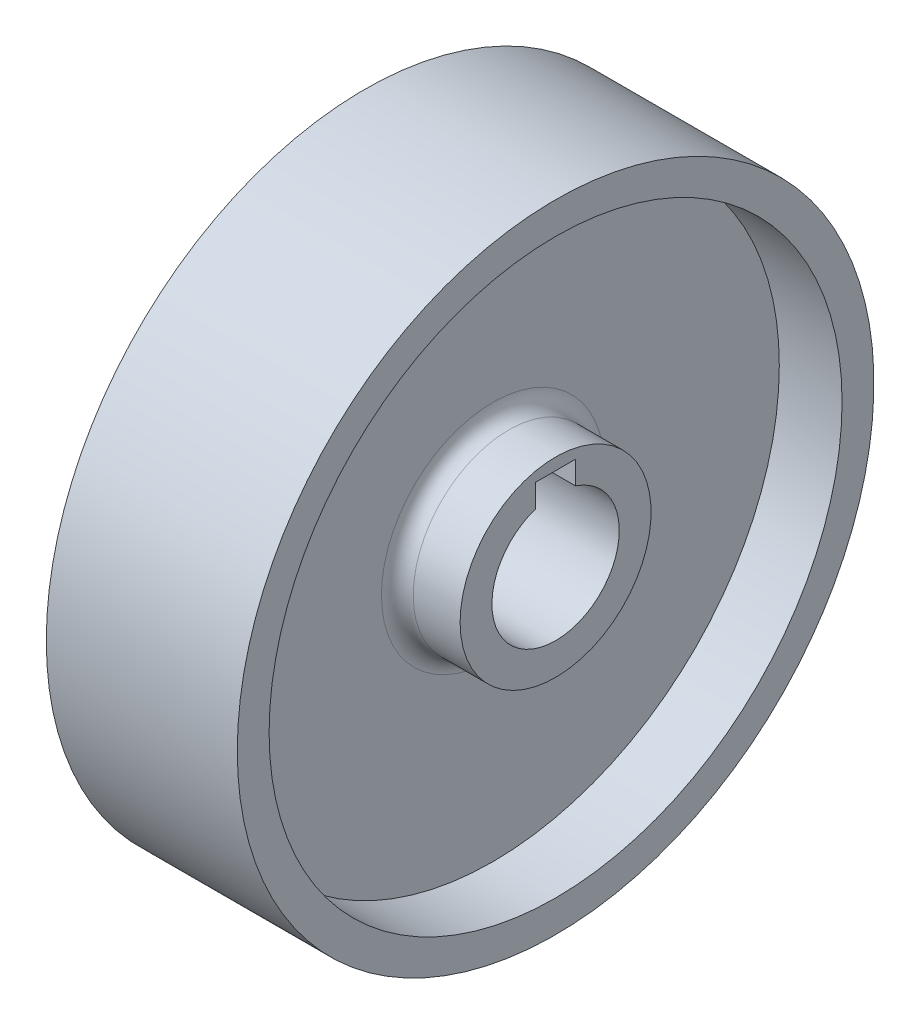
ISO-10303-21;
HEADER;
FILE_DESCRIPTION(('STEP AP214'),'2;1');
FILE_NAME('part.step','',(''),(''),'','','');
FILE_SCHEMA(('AUTOMOTIVE_DESIGN { 1 0 10303 214 1 1 1 1 }'));
ENDSEC;
DATA;
#1=APPLICATION_CONTEXT('core data for automotive mechanical design processes');
#2=APPLICATION_PROTOCOL_DEFINITION('international standard','automotive_design',2000,#1);
#3=PRODUCT_CONTEXT('',#1,'mechanical');
#4=PRODUCT('Part','Part','',(#3));
#5=PRODUCT_RELATED_PRODUCT_CATEGORY('part','',(#4));
#6=PRODUCT_DEFINITION_FORMATION('','',#4);
#7=PRODUCT_DEFINITION_CONTEXT('part definition',#1,'design');
#8=PRODUCT_DEFINITION('design','',#6,#7);
#9=PRODUCT_DEFINITION_SHAPE('','',#8);
#10=(LENGTH_UNIT() NAMED_UNIT(*) SI_UNIT(.MILLI.,.METRE.));
#11=(NAMED_UNIT(*) PLANE_ANGLE_UNIT() SI_UNIT($,.RADIAN.));
#12=(NAMED_UNIT(*) SI_UNIT($,.STERADIAN.) SOLID_ANGLE_UNIT());
#13=UNCERTAINTY_MEASURE_WITH_UNIT(LENGTH_MEASURE(1.E-05),#10,'distance_accuracy_value','');
#14=(GEOMETRIC_REPRESENTATION_CONTEXT(3) GLOBAL_UNCERTAINTY_ASSIGNED_CONTEXT((#13)) GLOBAL_UNIT_ASSIGNED_CONTEXT((#10,
#11,#12)) REPRESENTATION_CONTEXT('',''));
#15=CARTESIAN_POINT('',(0.,0.,0.));
#16=DIRECTION('',(0.,0.,1.));
#17=DIRECTION('',(1.,0.,0.));
#18=AXIS2_PLACEMENT_3D('',#15,#16,#17);
#19=CARTESIAN_POINT('',(-20.4571428571429,-26.4571428571429,0.));
#20=DIRECTION('',(-1.,0.,0.));
#21=DIRECTION('',(0.,0.,1.));
#22=AXIS2_PLACEMENT_3D('',#19,#20,#21);
#23=CYLINDRICAL_SURFACE('',#22,40.);
#24=CARTESIAN_POINT('',(-12.1142857142857,-26.4571428571429,0.));
#25=DIRECTION('',(-1.,0.,0.));
#26=DIRECTION('',(0.,0.,1.));
#27=AXIS2_PLACEMENT_3D('',#24,#25,#26);
#28=CIRCLE('',#27,40.);
#29=CARTESIAN_POINT('',(-12.1142857142857,-26.4571428571429,40.));
#30=VERTEX_POINT('',#29);
#31=EDGE_CURVE('E141',#30,#30,#28,.T.);
#32=ORIENTED_EDGE('',*,*,#31,.F.);
#33=EDGE_LOOP('',(#32));
#34=FACE_BOUND('',#33,.T.);
#35=CARTESIAN_POINT('',(11.8857142857142,-26.4571428571429,0.));
#36=DIRECTION('',(-1.,0.,0.));
#37=DIRECTION('',(0.,0.,1.));
#38=AXIS2_PLACEMENT_3D('',#35,#36,#37);
#39=CIRCLE('',#38,40.);
#40=CARTESIAN_POINT('',(11.8857142857142,-26.4571428571429,40.));
#41=VERTEX_POINT('',#40);
#42=EDGE_CURVE('E138',#41,#41,#39,.T.);
#43=ORIENTED_EDGE('',*,*,#42,.T.);
#44=EDGE_LOOP('',(#43));
#45=FACE_BOUND('',#44,.T.);
#46=ADVANCED_FACE('F43',(#34,#45),#23,.T.);
#47=CARTESIAN_POINT('',(11.8857142857143,13.5428571428571,0.));
#48=DIRECTION('',(-1.,0.,0.));
#49=DIRECTION('',(0.,0.,1.));
#50=AXIS2_PLACEMENT_3D('',#47,#48,#49);
#51=PLANE('',#50);
#52=ORIENTED_EDGE('',*,*,#42,.F.);
#53=EDGE_LOOP('',(#52));
#54=FACE_BOUND('',#53,.T.);
#55=CARTESIAN_POINT('',(11.8857142857142,-26.4571428571429,0.));
#56=DIRECTION('',(-1.,0.,0.));
#57=DIRECTION('',(0.,0.,1.));
#58=AXIS2_PLACEMENT_3D('',#55,#56,#57);
#59=CIRCLE('',#58,36.);
#60=CARTESIAN_POINT('',(11.8857142857142,-26.4571428571429,36.));
#61=VERTEX_POINT('',#60);
#62=EDGE_CURVE('E135',#61,#61,#59,.T.);
#63=ORIENTED_EDGE('',*,*,#62,.T.);
#64=EDGE_LOOP('',(#63));
#65=FACE_BOUND('',#64,.T.);
#66=ADVANCED_FACE('F166',(#54,#65),#51,.F.);
#67=CARTESIAN_POINT('',(-20.4571428571429,-26.4571428571429,0.));
#68=DIRECTION('',(-1.,0.,0.));
#69=DIRECTION('',(0.,0.,1.));
#70=AXIS2_PLACEMENT_3D('',#67,#68,#69);
#71=CYLINDRICAL_SURFACE('',#70,36.);
#72=ORIENTED_EDGE('',*,*,#62,.F.);
#73=EDGE_LOOP('',(#72));
#74=FACE_BOUND('',#73,.T.);
#75=CARTESIAN_POINT('',(4.,-26.4571428571429,0.));
#76=DIRECTION('',(-1.,0.,0.));
#77=DIRECTION('',(0.,0.,1.));
#78=AXIS2_PLACEMENT_3D('',#75,#76,#77);
#79=CIRCLE('',#78,36.);
#80=CARTESIAN_POINT('',(4.,-26.4571428571429,36.));
#81=VERTEX_POINT('',#80);
#82=EDGE_CURVE('E132',#81,#81,#79,.T.);
#83=ORIENTED_EDGE('',*,*,#82,.T.);
#84=EDGE_LOOP('',(#83));
#85=FACE_BOUND('',#84,.T.);
#86=ADVANCED_FACE('F172',(#74,#85),#71,.F.);
#87=CARTESIAN_POINT('',(4.,9.54285714285709,0.));
#88=DIRECTION('',(-1.,0.,0.));
#89=DIRECTION('',(0.,0.,1.));
#90=AXIS2_PLACEMENT_3D('',#87,#88,#89);
#91=PLANE('',#90);
#92=CARTESIAN_POINT('',(4.,-26.4571428571429,0.));
#93=DIRECTION('',(-1.,0.,0.));
#94=DIRECTION('',(0.,0.,1.));
#95=AXIS2_PLACEMENT_3D('',#92,#93,#94);
#96=CIRCLE('',#95,14.);
#97=CARTESIAN_POINT('',(4.,-26.4571428571429,14.));
#98=VERTEX_POINT('',#97);
#99=EDGE_CURVE('E145',#98,#98,#96,.T.);
#100=ORIENTED_EDGE('',*,*,#99,.T.);
#101=EDGE_LOOP('',(#100));
#102=FACE_BOUND('',#101,.T.);
#103=ORIENTED_EDGE('',*,*,#82,.F.);
#104=EDGE_LOOP('',(#103));
#105=FACE_BOUND('',#104,.T.);
#106=ADVANCED_FACE('F180',(#102,#105),#91,.F.);
#107=CARTESIAN_POINT('',(-20.4571428571429,-26.4571428571429,0.));
#108=DIRECTION('',(-1.,0.,0.));
#109=DIRECTION('',(0.,0.,1.));
#110=AXIS2_PLACEMENT_3D('',#107,#108,#109);
#111=CYLINDRICAL_SURFACE('',#110,12.);
#112=CARTESIAN_POINT('',(6.,-26.4571428571429,0.));
#113=DIRECTION('',(-1.,0.,0.));
#114=DIRECTION('',(0.,0.,1.));
#115=AXIS2_PLACEMENT_3D('',#112,#113,#114);
#116=CIRCLE('',#115,12.);
#117=CARTESIAN_POINT('',(6.,-26.4571428571429,12.));
#118=VERTEX_POINT('',#117);
#119=EDGE_CURVE('E148',#118,#118,#116,.F.);
#120=ORIENTED_EDGE('',*,*,#119,.T.);
#121=EDGE_LOOP('',(#120));
#122=FACE_BOUND('',#121,.T.);
#123=CARTESIAN_POINT('',(11.8857142857142,-26.4571428571429,0.));
#124=DIRECTION('',(-1.,0.,0.));
#125=DIRECTION('',(0.,0.,1.));
#126=AXIS2_PLACEMENT_3D('',#123,#124,#125);
#127=CIRCLE('',#126,12.);
#128=CARTESIAN_POINT('',(11.8857142857142,-26.4571428571429,12.));
#129=VERTEX_POINT('',#128);
#130=EDGE_CURVE('E129',#129,#129,#127,.T.);
#131=ORIENTED_EDGE('',*,*,#130,.T.);
#132=EDGE_LOOP('',(#131));
#133=FACE_BOUND('',#132,.T.);
#134=ADVANCED_FACE('F184',(#122,#133),#111,.T.);
#135=CARTESIAN_POINT('',(11.8857142857143,-14.4571428571429,0.));
#136=DIRECTION('',(-1.,0.,0.));
#137=DIRECTION('',(0.,0.,1.));
#138=AXIS2_PLACEMENT_3D('',#135,#136,#137);
#139=PLANE('',#138);
#140=ORIENTED_EDGE('',*,*,#130,.F.);
#141=EDGE_LOOP('',(#140));
#142=FACE_BOUND('',#141,.T.);
#143=DIRECTION('',(0.,0.,-1.));
#144=VECTOR('',#143,1.);
#145=CARTESIAN_POINT('',(11.8857142857143,-15.9571428571429,0.));
#146=LINE('',#145,#144);
#147=CARTESIAN_POINT('',(11.8857142857142,-15.9571428571429,2.5));
#148=VERTEX_POINT('',#147);
#149=CARTESIAN_POINT('',(11.8857142857142,-15.9571428571429,-2.5));
#150=VERTEX_POINT('',#149);
#151=EDGE_CURVE('E92',#148,#150,#146,.T.);
#152=ORIENTED_EDGE('',*,*,#151,.T.);
#153=DIRECTION('',(0.,-1.,0.));
#154=VECTOR('',#153,1.);
#155=CARTESIAN_POINT('',(11.8857142857143,-14.4571428571429,-2.5));
#156=LINE('',#155,#154);
#157=CARTESIAN_POINT('',(11.8857142857142,-18.8578007803576,-2.5));
#158=VERTEX_POINT('',#157);
#159=EDGE_CURVE('E112',#150,#158,#156,.T.);
#160=ORIENTED_EDGE('',*,*,#159,.T.);
#161=CARTESIAN_POINT('',(11.8857142857142,-26.4571428571429,0.));
#162=DIRECTION('',(-1.,0.,0.));
#163=DIRECTION('',(0.,0.,1.));
#164=AXIS2_PLACEMENT_3D('',#161,#162,#163);
#165=CIRCLE('',#164,8.);
#166=CARTESIAN_POINT('',(11.8857142857142,-18.8578007803576,2.5));
#167=VERTEX_POINT('',#166);
#168=EDGE_CURVE('E126',#158,#167,#165,.T.);
#169=ORIENTED_EDGE('',*,*,#168,.T.);
#170=DIRECTION('',(0.,1.,0.));
#171=VECTOR('',#170,1.);
#172=CARTESIAN_POINT('',(11.8857142857143,-14.4571428571429,2.5));
#173=LINE('',#172,#171);
#174=EDGE_CURVE('E109',#167,#148,#173,.T.);
#175=ORIENTED_EDGE('',*,*,#174,.T.);
#176=EDGE_LOOP('',(#152,#160,#169,#175));
#177=FACE_BOUND('',#176,.T.);
#178=ADVANCED_FACE('F188',(#142,#177),#139,.F.);
#179=CARTESIAN_POINT('',(-20.4571428571429,-26.4571428571429,0.));
#180=DIRECTION('',(-1.,0.,0.));
#181=DIRECTION('',(0.,0.,1.));
#182=AXIS2_PLACEMENT_3D('',#179,#180,#181);
#183=CYLINDRICAL_SURFACE('',#182,8.);
#184=ORIENTED_EDGE('',*,*,#168,.F.);
#185=DIRECTION('',(-1.,0.,0.));
#186=VECTOR('',#185,1.);
#187=CARTESIAN_POINT('',(-20.4571428571429,-18.8578007803576,-2.5));
#188=LINE('',#187,#186);
#189=CARTESIAN_POINT('',(-12.1142857142857,-18.8578007803576,-2.5));
#190=VERTEX_POINT('',#189);
#191=EDGE_CURVE('E66',#158,#190,#188,.T.);
#192=ORIENTED_EDGE('',*,*,#191,.T.);
#193=CARTESIAN_POINT('',(-12.1142857142857,-26.4571428571429,0.));
#194=DIRECTION('',(-1.,0.,0.));
#195=DIRECTION('',(0.,0.,1.));
#196=AXIS2_PLACEMENT_3D('',#193,#194,#195);
#197=CIRCLE('',#196,8.);
#198=CARTESIAN_POINT('',(-12.1142857142857,-18.8578007803576,2.5));
#199=VERTEX_POINT('',#198);
#200=EDGE_CURVE('E124',#190,#199,#197,.T.);
#201=ORIENTED_EDGE('',*,*,#200,.T.);
#202=DIRECTION('',(-1.,0.,0.));
#203=VECTOR('',#202,1.);
#204=CARTESIAN_POINT('',(-20.4571428571429,-18.8578007803576,2.5));
#205=LINE('',#204,#203);
#206=EDGE_CURVE('E58',#199,#167,#205,.F.);
#207=ORIENTED_EDGE('',*,*,#206,.T.);
#208=EDGE_LOOP('',(#184,#192,#201,#207));
#209=FACE_BOUND('',#208,.T.);
#210=ADVANCED_FACE('F192',(#209),#183,.F.);
#211=CARTESIAN_POINT('',(-12.1142857142857,-18.4571428571429,0.));
#212=DIRECTION('',(1.,0.,0.));
#213=DIRECTION('',(0.,0.,-1.));
#214=AXIS2_PLACEMENT_3D('',#211,#212,#213);
#215=PLANE('',#214);
#216=ORIENTED_EDGE('',*,*,#200,.F.);
#217=DIRECTION('',(0.,1.,0.));
#218=VECTOR('',#217,1.);
#219=CARTESIAN_POINT('',(-12.1142857142857,-18.4571428571429,-2.5));
#220=LINE('',#219,#218);
#221=CARTESIAN_POINT('',(-12.1142857142857,-15.9571428571429,-2.5));
#222=VERTEX_POINT('',#221);
#223=EDGE_CURVE('E104',#190,#222,#220,.T.);
#224=ORIENTED_EDGE('',*,*,#223,.T.);
#225=DIRECTION('',(0.,0.,1.));
#226=VECTOR('',#225,1.);
#227=CARTESIAN_POINT('',(-12.1142857142857,-15.9571428571429,2.5));
#228=LINE('',#227,#226);
#229=CARTESIAN_POINT('',(-12.1142857142857,-15.9571428571429,2.5));
#230=VERTEX_POINT('',#229);
#231=EDGE_CURVE('E89',#222,#230,#228,.T.);
#232=ORIENTED_EDGE('',*,*,#231,.T.);
#233=DIRECTION('',(0.,-1.,0.));
#234=VECTOR('',#233,1.);
#235=CARTESIAN_POINT('',(-12.1142857142857,-20.4216382657751,2.5));
#236=LINE('',#235,#234);
#237=EDGE_CURVE('E95',#230,#199,#236,.T.);
#238=ORIENTED_EDGE('',*,*,#237,.T.);
#239=EDGE_LOOP('',(#216,#224,#232,#238));
#240=FACE_BOUND('',#239,.T.);
#241=CARTESIAN_POINT('',(-12.1142857142857,-26.4571428571429,0.));
#242=DIRECTION('',(-1.,0.,0.));
#243=DIRECTION('',(0.,0.,1.));
#244=AXIS2_PLACEMENT_3D('',#241,#242,#243);
#245=CIRCLE('',#244,12.);
#246=CARTESIAN_POINT('',(-12.1142857142857,-26.4571428571429,12.));
#247=VERTEX_POINT('',#246);
#248=EDGE_CURVE('E121',#247,#247,#245,.T.);
#249=ORIENTED_EDGE('',*,*,#248,.T.);
#250=EDGE_LOOP('',(#249));
#251=FACE_BOUND('',#250,.T.);
#252=ADVANCED_FACE('F102',(#240,#251),#215,.F.);
#253=CARTESIAN_POINT('',(-20.4571428571429,-26.4571428571429,0.));
#254=DIRECTION('',(-1.,0.,0.));
#255=DIRECTION('',(0.,0.,1.));
#256=AXIS2_PLACEMENT_3D('',#253,#254,#255);
#257=CYLINDRICAL_SURFACE('',#256,12.);
#258=CARTESIAN_POINT('',(-6.,-26.4571428571429,0.));
#259=DIRECTION('',(1.,0.,0.));
#260=DIRECTION('',(0.,0.,-1.));
#261=AXIS2_PLACEMENT_3D('',#258,#259,#260);
#262=CIRCLE('',#261,12.);
#263=CARTESIAN_POINT('',(-6.,-26.4571428571429,-12.));
#264=VERTEX_POINT('',#263);
#265=EDGE_CURVE('E51',#264,#264,#262,.F.);
#266=ORIENTED_EDGE('',*,*,#265,.T.);
#267=EDGE_LOOP('',(#266));
#268=FACE_BOUND('',#267,.T.);
#269=ORIENTED_EDGE('',*,*,#248,.F.);
#270=EDGE_LOOP('',(#269));
#271=FACE_BOUND('',#270,.T.);
#272=ADVANCED_FACE('F153',(#268,#271),#257,.T.);
#273=CARTESIAN_POINT('',(-4.,-14.4571428571429,0.));
#274=DIRECTION('',(1.,0.,0.));
#275=DIRECTION('',(0.,0.,-1.));
#276=AXIS2_PLACEMENT_3D('',#273,#274,#275);
#277=PLANE('',#276);
#278=CARTESIAN_POINT('',(-4.,-26.4571428571429,0.));
#279=DIRECTION('',(1.,0.,0.));
#280=DIRECTION('',(0.,0.,-1.));
#281=AXIS2_PLACEMENT_3D('',#278,#279,#280);
#282=CIRCLE('',#281,14.);
#283=CARTESIAN_POINT('',(-4.,-26.4571428571429,-14.));
#284=VERTEX_POINT('',#283);
#285=EDGE_CURVE('E11',#284,#284,#282,.T.);
#286=ORIENTED_EDGE('',*,*,#285,.T.);
#287=EDGE_LOOP('',(#286));
#288=FACE_BOUND('',#287,.T.);
#289=CARTESIAN_POINT('',(-4.,-26.4571428571429,0.));
#290=DIRECTION('',(-1.,0.,0.));
#291=DIRECTION('',(0.,0.,1.));
#292=AXIS2_PLACEMENT_3D('',#289,#290,#291);
#293=CIRCLE('',#292,36.);
#294=CARTESIAN_POINT('',(-4.,-26.4571428571429,36.));
#295=VERTEX_POINT('',#294);
#296=EDGE_CURVE('E118',#295,#295,#293,.T.);
#297=ORIENTED_EDGE('',*,*,#296,.T.);
#298=EDGE_LOOP('',(#297));
#299=FACE_BOUND('',#298,.T.);
#300=ADVANCED_FACE('F201',(#288,#299),#277,.F.);
#301=CARTESIAN_POINT('',(-20.4571428571429,-26.4571428571429,0.));
#302=DIRECTION('',(-1.,0.,0.));
#303=DIRECTION('',(0.,0.,1.));
#304=AXIS2_PLACEMENT_3D('',#301,#302,#303);
#305=CYLINDRICAL_SURFACE('',#304,36.);
#306=ORIENTED_EDGE('',*,*,#296,.F.);
#307=EDGE_LOOP('',(#306));
#308=FACE_BOUND('',#307,.T.);
#309=CARTESIAN_POINT('',(-12.1142857142857,-26.4571428571429,0.));
#310=DIRECTION('',(-1.,0.,0.));
#311=DIRECTION('',(0.,0.,1.));
#312=AXIS2_PLACEMENT_3D('',#309,#310,#311);
#313=CIRCLE('',#312,36.);
#314=CARTESIAN_POINT('',(-12.1142857142857,-26.4571428571429,36.));
#315=VERTEX_POINT('',#314);
#316=EDGE_CURVE('E115',#315,#315,#313,.T.);
#317=ORIENTED_EDGE('',*,*,#316,.T.);
#318=EDGE_LOOP('',(#317));
#319=FACE_BOUND('',#318,.T.);
#320=ADVANCED_FACE('F203',(#308,#319),#305,.F.);
#321=CARTESIAN_POINT('',(-12.1142857142857,9.54285714285709,0.));
#322=DIRECTION('',(1.,0.,0.));
#323=DIRECTION('',(0.,0.,-1.));
#324=AXIS2_PLACEMENT_3D('',#321,#322,#323);
#325=PLANE('',#324);
#326=ORIENTED_EDGE('',*,*,#316,.F.);
#327=EDGE_LOOP('',(#326));
#328=FACE_BOUND('',#327,.T.);
#329=ORIENTED_EDGE('',*,*,#31,.T.);
#330=EDGE_LOOP('',(#329));
#331=FACE_BOUND('',#330,.T.);
#332=ADVANCED_FACE('F207',(#328,#331),#325,.F.);
#333=CARTESIAN_POINT('',(-12.1142857142857,-15.9571428571429,2.5));
#334=DIRECTION('',(0.,1.,0.));
#335=DIRECTION('',(0.,0.,1.));
#336=AXIS2_PLACEMENT_3D('',#333,#334,#335);
#337=PLANE('',#336);
#338=DIRECTION('',(1.,0.,0.));
#339=VECTOR('',#338,1.);
#340=CARTESIAN_POINT('',(-12.1142857142857,-15.9571428571429,2.5));
#341=LINE('',#340,#339);
#342=EDGE_CURVE('E85',#230,#148,#341,.T.);
#343=ORIENTED_EDGE('',*,*,#342,.F.);
#344=ORIENTED_EDGE('',*,*,#231,.F.);
#345=DIRECTION('',(1.,0.,0.));
#346=VECTOR('',#345,1.);
#347=CARTESIAN_POINT('',(-12.1142857142857,-15.9571428571429,-2.5));
#348=LINE('',#347,#346);
#349=EDGE_CURVE('E94',#222,#150,#348,.T.);
#350=ORIENTED_EDGE('',*,*,#349,.T.);
#351=ORIENTED_EDGE('',*,*,#151,.F.);
#352=EDGE_LOOP('',(#343,#344,#350,#351));
#353=FACE_BOUND('',#352,.T.);
#354=ADVANCED_FACE('F86',(#353),#337,.F.);
#355=CARTESIAN_POINT('',(-12.1142857142857,-15.9571428571429,-2.5));
#356=DIRECTION('',(0.,0.,-1.));
#357=DIRECTION('',(-1.,0.,0.));
#358=AXIS2_PLACEMENT_3D('',#355,#356,#357);
#359=PLANE('',#358);
#360=ORIENTED_EDGE('',*,*,#349,.F.);
#361=ORIENTED_EDGE('',*,*,#223,.F.);
#362=ORIENTED_EDGE('',*,*,#191,.F.);
#363=ORIENTED_EDGE('',*,*,#159,.F.);
#364=EDGE_LOOP('',(#360,#361,#362,#363));
#365=FACE_BOUND('',#364,.T.);
#366=ADVANCED_FACE('F214',(#365),#359,.F.);
#367=CARTESIAN_POINT('',(-12.1142857142857,-20.4216382657751,2.5));
#368=DIRECTION('',(0.,0.,1.));
#369=DIRECTION('',(1.,0.,0.));
#370=AXIS2_PLACEMENT_3D('',#367,#368,#369);
#371=PLANE('',#370);
#372=ORIENTED_EDGE('',*,*,#206,.F.);
#373=ORIENTED_EDGE('',*,*,#237,.F.);
#374=ORIENTED_EDGE('',*,*,#342,.T.);
#375=ORIENTED_EDGE('',*,*,#174,.F.);
#376=EDGE_LOOP('',(#372,#373,#374,#375));
#377=FACE_BOUND('',#376,.T.);
#378=ADVANCED_FACE('F97',(#377),#371,.F.);
#379=CARTESIAN_POINT('',(6.,-26.4571428571429,0.));
#380=DIRECTION('',(-1.,0.,0.));
#381=DIRECTION('',(0.,0.,1.));
#382=AXIS2_PLACEMENT_3D('',#379,#380,#381);
#383=TOROIDAL_SURFACE('',#382,14.,2.);
#384=ORIENTED_EDGE('',*,*,#119,.F.);
#385=EDGE_LOOP('',(#384));
#386=FACE_BOUND('',#385,.T.);
#387=ORIENTED_EDGE('',*,*,#99,.F.);
#388=EDGE_LOOP('',(#387));
#389=FACE_BOUND('',#388,.T.);
#390=ADVANCED_FACE('F157',(#386,#389),#383,.F.);
#391=CARTESIAN_POINT('',(-6.,-26.4571428571429,0.));
#392=DIRECTION('',(1.,0.,0.));
#393=DIRECTION('',(0.,0.,-1.));
#394=AXIS2_PLACEMENT_3D('',#391,#392,#393);
#395=TOROIDAL_SURFACE('',#394,14.,2.);
#396=ORIENTED_EDGE('',*,*,#285,.F.);
#397=EDGE_LOOP('',(#396));
#398=FACE_BOUND('',#397,.T.);
#399=ORIENTED_EDGE('',*,*,#265,.F.);
#400=EDGE_LOOP('',(#399));
#401=FACE_BOUND('',#400,.T.);
#402=ADVANCED_FACE('F45',(#398,#401),#395,.F.);
#403=CLOSED_SHELL('',(#46,#66,#86,#106,#134,#178,#210,#252,#272,#300,#320,#332,#354,#366,#378,
#390,#402));
#404=MANIFOLD_SOLID_BREP('B2',#403);
#405=ADVANCED_BREP_SHAPE_REPRESENTATION('',(#18,#404),#14);
#406=SHAPE_DEFINITION_REPRESENTATION(#9,#405);
ENDSEC;
END-ISO-10303-21;
